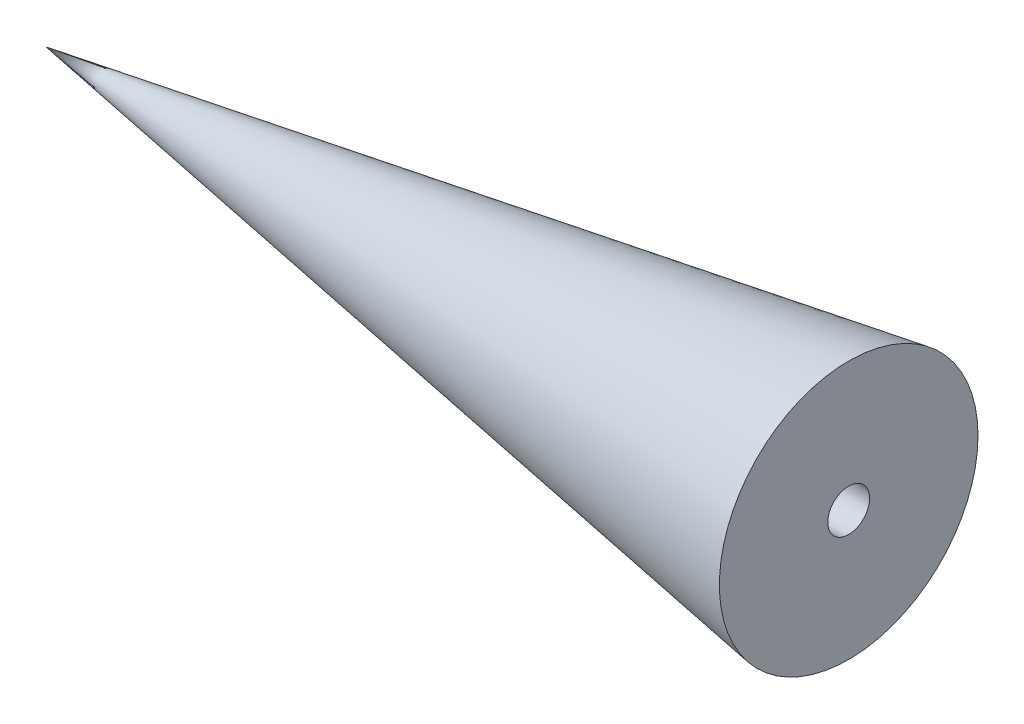
ISO-10303-21;
HEADER;
FILE_DESCRIPTION(('STEP AP214'),'2;1');
FILE_NAME('part.step','',(''),(''),'','','');
FILE_SCHEMA(('AUTOMOTIVE_DESIGN { 1 0 10303 214 1 1 1 1 }'));
ENDSEC;
DATA;
#1=APPLICATION_CONTEXT('core data for automotive mechanical design processes');
#2=APPLICATION_PROTOCOL_DEFINITION('international standard','automotive_design',2000,#1);
#3=PRODUCT_CONTEXT('',#1,'mechanical');
#4=PRODUCT('Part','Part','',(#3));
#5=PRODUCT_RELATED_PRODUCT_CATEGORY('part','',(#4));
#6=PRODUCT_DEFINITION_FORMATION('','',#4);
#7=PRODUCT_DEFINITION_CONTEXT('part definition',#1,'design');
#8=PRODUCT_DEFINITION('design','',#6,#7);
#9=PRODUCT_DEFINITION_SHAPE('','',#8);
#10=(LENGTH_UNIT() NAMED_UNIT(*) SI_UNIT(.MILLI.,.METRE.));
#11=(NAMED_UNIT(*) PLANE_ANGLE_UNIT() SI_UNIT($,.RADIAN.));
#12=(NAMED_UNIT(*) SI_UNIT($,.STERADIAN.) SOLID_ANGLE_UNIT());
#13=UNCERTAINTY_MEASURE_WITH_UNIT(LENGTH_MEASURE(1.E-05),#10,'distance_accuracy_value','');
#14=(GEOMETRIC_REPRESENTATION_CONTEXT(3) GLOBAL_UNCERTAINTY_ASSIGNED_CONTEXT((#13)) GLOBAL_UNIT_ASSIGNED_CONTEXT((#10,
#11,#12)) REPRESENTATION_CONTEXT('',''));
#15=CARTESIAN_POINT('',(0.,0.,0.));
#16=DIRECTION('',(0.,0.,1.));
#17=DIRECTION('',(1.,0.,0.));
#18=AXIS2_PLACEMENT_3D('',#15,#16,#17);
#19=CARTESIAN_POINT('',(0.,0.,0.));
#20=DIRECTION('',(1.,0.,0.));
#21=DIRECTION('',(0.,0.,-1.));
#22=AXIS2_PLACEMENT_3D('',#19,#20,#21);
#23=CONICAL_SURFACE('',#22,18.525,0.159714907105315);
#24=CARTESIAN_POINT('',(-115.,0.,0.));
#25=VERTEX_POINT('',#24);
#26=VERTEX_LOOP('',#25);
#27=FACE_BOUND('',#26,.T.);
#28=CARTESIAN_POINT('',(0.,0.,0.));
#29=DIRECTION('',(1.,0.,0.));
#30=DIRECTION('',(0.,0.,-1.));
#31=AXIS2_PLACEMENT_3D('',#28,#29,#30);
#32=CIRCLE('',#31,18.525);
#33=CARTESIAN_POINT('',(0.,0.,-18.525));
#34=VERTEX_POINT('',#33);
#35=EDGE_CURVE('E11',#34,#34,#32,.T.);
#36=ORIENTED_EDGE('',*,*,#35,.F.);
#37=EDGE_LOOP('',(#36));
#38=FACE_BOUND('',#37,.T.);
#39=ADVANCED_FACE('F45',(#27,#38),#23,.T.);
#40=CARTESIAN_POINT('',(0.,0.,0.));
#41=DIRECTION('',(1.,0.,0.));
#42=DIRECTION('',(0.,0.,-1.));
#43=AXIS2_PLACEMENT_3D('',#40,#41,#42);
#44=PLANE('',#43);
#45=CARTESIAN_POINT('',(0.,0.,0.));
#46=DIRECTION('',(1.,0.,0.));
#47=DIRECTION('',(0.,0.,-1.));
#48=AXIS2_PLACEMENT_3D('',#45,#46,#47);
#49=CIRCLE('',#48,3.);
#50=CARTESIAN_POINT('',(0.,0.,-3.));
#51=VERTEX_POINT('',#50);
#52=EDGE_CURVE('E78',#51,#51,#49,.T.);
#53=ORIENTED_EDGE('',*,*,#52,.F.);
#54=EDGE_LOOP('',(#53));
#55=FACE_BOUND('',#54,.T.);
#56=ORIENTED_EDGE('',*,*,#35,.T.);
#57=EDGE_LOOP('',(#56));
#58=FACE_BOUND('',#57,.T.);
#59=ADVANCED_FACE('F57',(#55,#58),#44,.T.);
#60=CARTESIAN_POINT('',(-50.,0.,0.));
#61=DIRECTION('',(1.,0.,0.));
#62=DIRECTION('',(0.,0.,-1.));
#63=AXIS2_PLACEMENT_3D('',#60,#61,#62);
#64=CYLINDRICAL_SURFACE('',#63,3.);
#65=CARTESIAN_POINT('',(-50.,0.,0.));
#66=DIRECTION('',(1.,0.,0.));
#67=DIRECTION('',(0.,0.,-1.));
#68=AXIS2_PLACEMENT_3D('',#65,#66,#67);
#69=CIRCLE('',#68,3.);
#70=CARTESIAN_POINT('',(-50.,0.,-3.));
#71=VERTEX_POINT('',#70);
#72=EDGE_CURVE('E52',#71,#71,#69,.T.);
#73=ORIENTED_EDGE('',*,*,#72,.F.);
#74=EDGE_LOOP('',(#73));
#75=FACE_BOUND('',#74,.T.);
#76=ORIENTED_EDGE('',*,*,#52,.T.);
#77=EDGE_LOOP('',(#76));
#78=FACE_BOUND('',#77,.T.);
#79=ADVANCED_FACE('F61',(#75,#78),#64,.F.);
#80=CARTESIAN_POINT('',(-50.,0.,0.));
#81=DIRECTION('',(1.,0.,0.));
#82=DIRECTION('',(0.,0.,-1.));
#83=AXIS2_PLACEMENT_3D('',#80,#81,#82);
#84=PLANE('',#83);
#85=ORIENTED_EDGE('',*,*,#72,.T.);
#86=EDGE_LOOP('',(#85));
#87=FACE_BOUND('',#86,.T.);
#88=ADVANCED_FACE('F65',(#87),#84,.T.);
#89=CLOSED_SHELL('',(#39,#59,#79,#88));
#90=MANIFOLD_SOLID_BREP('B2',#89);
#91=ADVANCED_BREP_SHAPE_REPRESENTATION('',(#18,#90),#14);
#92=SHAPE_DEFINITION_REPRESENTATION(#9,#91);
ENDSEC;
END-ISO-10303-21;
